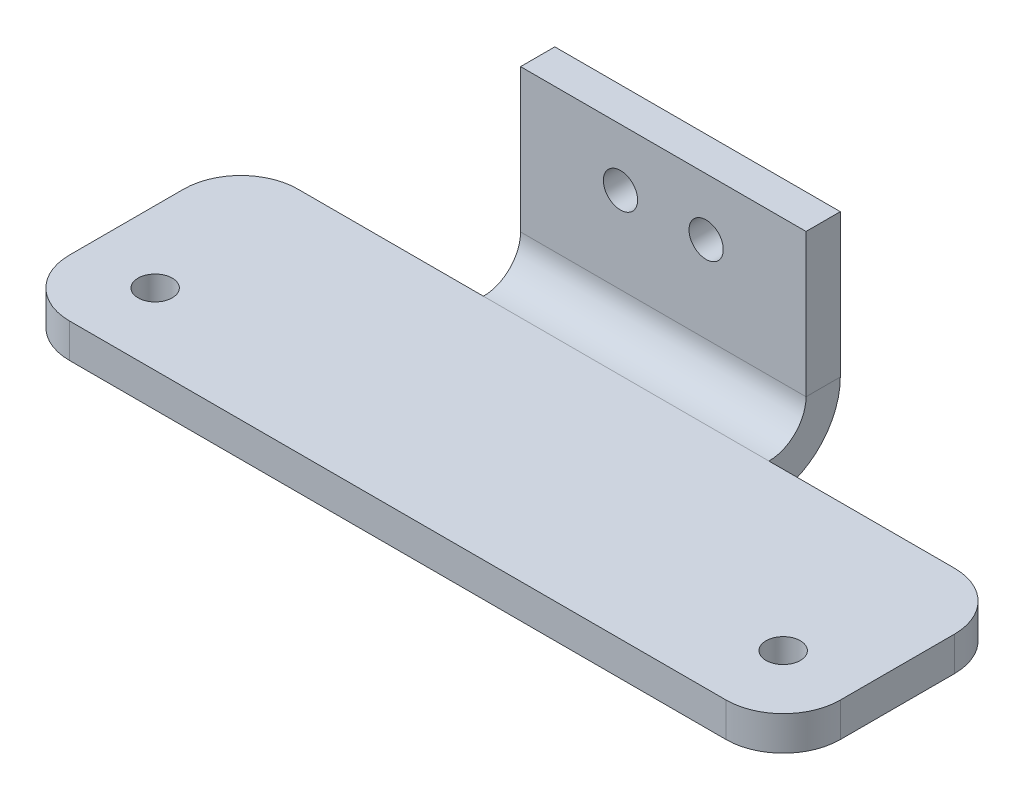
ISO-10303-21;
HEADER;
FILE_DESCRIPTION(('STEP AP214'),'2;1');
FILE_NAME('part.step','',(''),(''),'','','');
FILE_SCHEMA(('AUTOMOTIVE_DESIGN { 1 0 10303 214 1 1 1 1 }'));
ENDSEC;
DATA;
#1=APPLICATION_CONTEXT('core data for automotive mechanical design processes');
#2=APPLICATION_PROTOCOL_DEFINITION('international standard','automotive_design',2000,#1);
#3=PRODUCT_CONTEXT('',#1,'mechanical');
#4=PRODUCT('Part','Part','',(#3));
#5=PRODUCT_RELATED_PRODUCT_CATEGORY('part','',(#4));
#6=PRODUCT_DEFINITION_FORMATION('','',#4);
#7=PRODUCT_DEFINITION_CONTEXT('part definition',#1,'design');
#8=PRODUCT_DEFINITION('design','',#6,#7);
#9=PRODUCT_DEFINITION_SHAPE('','',#8);
#10=(LENGTH_UNIT() NAMED_UNIT(*) SI_UNIT(.MILLI.,.METRE.));
#11=(NAMED_UNIT(*) PLANE_ANGLE_UNIT() SI_UNIT($,.RADIAN.));
#12=(NAMED_UNIT(*) SI_UNIT($,.STERADIAN.) SOLID_ANGLE_UNIT());
#13=UNCERTAINTY_MEASURE_WITH_UNIT(LENGTH_MEASURE(1.E-05),#10,'distance_accuracy_value','');
#14=(GEOMETRIC_REPRESENTATION_CONTEXT(3) GLOBAL_UNCERTAINTY_ASSIGNED_CONTEXT((#13)) GLOBAL_UNIT_ASSIGNED_CONTEXT((#10,
#11,#12)) REPRESENTATION_CONTEXT('',''));
#15=CARTESIAN_POINT('',(0.,0.,0.));
#16=DIRECTION('',(0.,0.,1.));
#17=DIRECTION('',(1.,0.,0.));
#18=AXIS2_PLACEMENT_3D('',#15,#16,#17);
#19=CARTESIAN_POINT('',(0.,-28.4225651045515,-32.5000000000001));
#20=DIRECTION('',(0.,0.,1.));
#21=DIRECTION('',(0.,-1.,0.));
#22=AXIS2_PLACEMENT_3D('',#19,#20,#21);
#23=PLANE('',#22);
#24=CARTESIAN_POINT('',(-7.5,21.5774348954485,-32.5));
#25=DIRECTION('',(0.,0.,1.));
#26=DIRECTION('',(1.,0.,0.));
#27=AXIS2_PLACEMENT_3D('',#24,#25,#26);
#28=CIRCLE('',#27,3.);
#29=CARTESIAN_POINT('',(-4.5,21.5774348954485,-32.5));
#30=VERTEX_POINT('',#29);
#31=EDGE_CURVE('E428',#30,#30,#28,.T.);
#32=ORIENTED_EDGE('',*,*,#31,.T.);
#33=EDGE_LOOP('',(#32));
#34=FACE_BOUND('',#33,.T.);
#35=CARTESIAN_POINT('',(7.5,21.5774348954485,-32.5));
#36=DIRECTION('',(0.,0.,1.));
#37=DIRECTION('',(-1.,0.,0.));
#38=AXIS2_PLACEMENT_3D('',#35,#36,#37);
#39=CIRCLE('',#38,3.);
#40=CARTESIAN_POINT('',(4.5,21.5774348954485,-32.5));
#41=VERTEX_POINT('',#40);
#42=EDGE_CURVE('E408',#41,#41,#39,.T.);
#43=ORIENTED_EDGE('',*,*,#42,.T.);
#44=EDGE_LOOP('',(#43));
#45=FACE_BOUND('',#44,.T.);
#46=DIRECTION('',(0.,1.,0.));
#47=VECTOR('',#46,1.);
#48=CARTESIAN_POINT('',(25.,31.5774348954485,-32.4999999999999));
#49=LINE('',#48,#47);
#50=CARTESIAN_POINT('',(25.,6.50000000000005,-32.5));
#51=VERTEX_POINT('',#50);
#52=CARTESIAN_POINT('',(25.,31.5774348954485,-32.4999999999999));
#53=VERTEX_POINT('',#52);
#54=EDGE_CURVE('E185',#51,#53,#49,.T.);
#55=ORIENTED_EDGE('',*,*,#54,.F.);
#56=DIRECTION('',(-1.,0.,0.));
#57=VECTOR('',#56,1.);
#58=CARTESIAN_POINT('',(0.,6.50000000000005,-32.5));
#59=LINE('',#58,#57);
#60=CARTESIAN_POINT('',(-25.,6.50000000000005,-32.5));
#61=VERTEX_POINT('',#60);
#62=EDGE_CURVE('E159',#51,#61,#59,.T.);
#63=ORIENTED_EDGE('',*,*,#62,.T.);
#64=DIRECTION('',(0.,-1.,0.));
#65=VECTOR('',#64,1.);
#66=CARTESIAN_POINT('',(-25.,31.5774348954485,-32.4999999999999));
#67=LINE('',#66,#65);
#68=CARTESIAN_POINT('',(-25.,31.5774348954485,-32.4999999999999));
#69=VERTEX_POINT('',#68);
#70=EDGE_CURVE('E205',#69,#61,#67,.T.);
#71=ORIENTED_EDGE('',*,*,#70,.F.);
#72=DIRECTION('',(-1.,0.,0.));
#73=VECTOR('',#72,1.);
#74=CARTESIAN_POINT('',(-25.,31.5774348954485,-32.4999999999999));
#75=LINE('',#74,#73);
#76=EDGE_CURVE('E187',#53,#69,#75,.T.);
#77=ORIENTED_EDGE('',*,*,#76,.F.);
#78=EDGE_LOOP('',(#55,#63,#71,#77));
#79=FACE_BOUND('',#78,.T.);
#80=ADVANCED_FACE('F56',(#34,#45,#79),#23,.F.);
#81=CARTESIAN_POINT('',(-25.,31.5774348954485,-32.4999999999999));
#82=DIRECTION('',(-1.,0.,0.));
#83=DIRECTION('',(0.,-1.,0.));
#84=AXIS2_PLACEMENT_3D('',#81,#82,#83);
#85=PLANE('',#84);
#86=DIRECTION('',(0.,0.,-1.));
#87=VECTOR('',#86,1.);
#88=CARTESIAN_POINT('',(-25.,6.50000000000005,-32.5));
#89=LINE('',#88,#87);
#90=CARTESIAN_POINT('',(-25.,6.50000000000002,-26.5));
#91=VERTEX_POINT('',#90);
#92=EDGE_CURVE('E199',#91,#61,#89,.T.);
#93=ORIENTED_EDGE('',*,*,#92,.F.);
#94=DIRECTION('',(0.,-1.,0.));
#95=VECTOR('',#94,1.);
#96=CARTESIAN_POINT('',(-25.,31.5774348954485,-26.4999999999999));
#97=LINE('',#96,#95);
#98=CARTESIAN_POINT('',(-25.,31.5774348954485,-26.4999999999999));
#99=VERTEX_POINT('',#98);
#100=EDGE_CURVE('E191',#99,#91,#97,.T.);
#101=ORIENTED_EDGE('',*,*,#100,.F.);
#102=DIRECTION('',(0.,0.,1.));
#103=VECTOR('',#102,1.);
#104=CARTESIAN_POINT('',(-25.,31.5774348954485,-32.4999999999999));
#105=LINE('',#104,#103);
#106=EDGE_CURVE('E172',#69,#99,#105,.T.);
#107=ORIENTED_EDGE('',*,*,#106,.F.);
#108=ORIENTED_EDGE('',*,*,#70,.T.);
#109=EDGE_LOOP('',(#93,#101,#107,#108));
#110=FACE_BOUND('',#109,.T.);
#111=ADVANCED_FACE('F333',(#110),#85,.T.);
#112=CARTESIAN_POINT('',(-25.,31.5774348954485,-32.4999999999999));
#113=DIRECTION('',(0.,1.,0.));
#114=DIRECTION('',(-1.,0.,0.));
#115=AXIS2_PLACEMENT_3D('',#112,#113,#114);
#116=PLANE('',#115);
#117=DIRECTION('',(-1.,0.,0.));
#118=VECTOR('',#117,1.);
#119=CARTESIAN_POINT('',(-25.,31.5774348954485,-26.4999999999999));
#120=LINE('',#119,#118);
#121=CARTESIAN_POINT('',(25.,31.5774348954485,-26.4999999999999));
#122=VERTEX_POINT('',#121);
#123=EDGE_CURVE('E210',#122,#99,#120,.T.);
#124=ORIENTED_EDGE('',*,*,#123,.F.);
#125=DIRECTION('',(0.,0.,1.));
#126=VECTOR('',#125,1.);
#127=CARTESIAN_POINT('',(25.,31.5774348954485,-32.4999999999999));
#128=LINE('',#127,#126);
#129=EDGE_CURVE('E207',#53,#122,#128,.T.);
#130=ORIENTED_EDGE('',*,*,#129,.F.);
#131=ORIENTED_EDGE('',*,*,#76,.T.);
#132=ORIENTED_EDGE('',*,*,#106,.T.);
#133=EDGE_LOOP('',(#124,#130,#131,#132));
#134=FACE_BOUND('',#133,.T.);
#135=ADVANCED_FACE('F287',(#134),#116,.T.);
#136=CARTESIAN_POINT('',(25.,31.5774348954485,-32.4999999999999));
#137=DIRECTION('',(1.,0.,0.));
#138=DIRECTION('',(0.,1.,0.));
#139=AXIS2_PLACEMENT_3D('',#136,#137,#138);
#140=PLANE('',#139);
#141=DIRECTION('',(0.,0.,1.));
#142=VECTOR('',#141,1.);
#143=CARTESIAN_POINT('',(25.,6.50000000000005,-32.5));
#144=LINE('',#143,#142);
#145=CARTESIAN_POINT('',(25.,6.50000000000002,-26.5));
#146=VERTEX_POINT('',#145);
#147=EDGE_CURVE('E171',#51,#146,#144,.T.);
#148=ORIENTED_EDGE('',*,*,#147,.F.);
#149=ORIENTED_EDGE('',*,*,#54,.T.);
#150=ORIENTED_EDGE('',*,*,#129,.T.);
#151=DIRECTION('',(0.,1.,0.));
#152=VECTOR('',#151,1.);
#153=CARTESIAN_POINT('',(25.,31.5774348954485,-26.4999999999999));
#154=LINE('',#153,#152);
#155=EDGE_CURVE('E195',#146,#122,#154,.T.);
#156=ORIENTED_EDGE('',*,*,#155,.F.);
#157=EDGE_LOOP('',(#148,#149,#150,#156));
#158=FACE_BOUND('',#157,.T.);
#159=ADVANCED_FACE('F194',(#158),#140,.T.);
#160=CARTESIAN_POINT('',(0.,-28.4225651045515,-26.5000000000001));
#161=DIRECTION('',(0.,0.,1.));
#162=DIRECTION('',(0.,-1.,0.));
#163=AXIS2_PLACEMENT_3D('',#160,#161,#162);
#164=PLANE('',#163);
#165=CARTESIAN_POINT('',(-7.5,21.5774348954485,-26.5));
#166=DIRECTION('',(0.,0.,1.));
#167=DIRECTION('',(1.,0.,0.));
#168=AXIS2_PLACEMENT_3D('',#165,#166,#167);
#169=CIRCLE('',#168,3.);
#170=CARTESIAN_POINT('',(-4.5,21.5774348954485,-26.5));
#171=VERTEX_POINT('',#170);
#172=EDGE_CURVE('E414',#171,#171,#169,.T.);
#173=ORIENTED_EDGE('',*,*,#172,.F.);
#174=EDGE_LOOP('',(#173));
#175=FACE_BOUND('',#174,.T.);
#176=CARTESIAN_POINT('',(7.5,21.5774348954485,-26.5));
#177=DIRECTION('',(0.,0.,1.));
#178=DIRECTION('',(-1.,0.,0.));
#179=AXIS2_PLACEMENT_3D('',#176,#177,#178);
#180=CIRCLE('',#179,3.);
#181=CARTESIAN_POINT('',(4.5,21.5774348954485,-26.5));
#182=VERTEX_POINT('',#181);
#183=EDGE_CURVE('E411',#182,#182,#180,.T.);
#184=ORIENTED_EDGE('',*,*,#183,.F.);
#185=EDGE_LOOP('',(#184));
#186=FACE_BOUND('',#185,.T.);
#187=DIRECTION('',(-1.,0.,0.));
#188=VECTOR('',#187,1.);
#189=CARTESIAN_POINT('',(0.,6.50000000000003,-26.5));
#190=LINE('',#189,#188);
#191=EDGE_CURVE('E197',#146,#91,#190,.T.);
#192=ORIENTED_EDGE('',*,*,#191,.F.);
#193=ORIENTED_EDGE('',*,*,#155,.T.);
#194=ORIENTED_EDGE('',*,*,#123,.T.);
#195=ORIENTED_EDGE('',*,*,#100,.T.);
#196=EDGE_LOOP('',(#192,#193,#194,#195));
#197=FACE_BOUND('',#196,.T.);
#198=ADVANCED_FACE('F290',(#175,#186,#197),#164,.T.);
#199=CARTESIAN_POINT('',(-67.5,-6.,-20.));
#200=DIRECTION('',(-1.,0.,0.));
#201=DIRECTION('',(0.,0.,1.));
#202=AXIS2_PLACEMENT_3D('',#199,#200,#201);
#203=PLANE('',#202);
#204=DIRECTION('',(0.,0.,1.));
#205=VECTOR('',#204,1.);
#206=CARTESIAN_POINT('',(-67.5,-6.,-20.));
#207=LINE('',#206,#205);
#208=CARTESIAN_POINT('',(-67.5,-6.,-10.));
#209=VERTEX_POINT('',#208);
#210=CARTESIAN_POINT('',(-67.5,-6.,10.));
#211=VERTEX_POINT('',#210);
#212=EDGE_CURVE('E247',#209,#211,#207,.T.);
#213=ORIENTED_EDGE('',*,*,#212,.T.);
#214=DIRECTION('',(0.,1.,0.));
#215=VECTOR('',#214,1.);
#216=CARTESIAN_POINT('',(-67.5,-6.,10.));
#217=LINE('',#216,#215);
#218=CARTESIAN_POINT('',(-67.5,0.,10.));
#219=VERTEX_POINT('',#218);
#220=EDGE_CURVE('E64',#211,#219,#217,.T.);
#221=ORIENTED_EDGE('',*,*,#220,.T.);
#222=DIRECTION('',(0.,0.,1.));
#223=VECTOR('',#222,1.);
#224=CARTESIAN_POINT('',(-67.5,0.,-20.));
#225=LINE('',#224,#223);
#226=CARTESIAN_POINT('',(-67.5,0.,-10.));
#227=VERTEX_POINT('',#226);
#228=EDGE_CURVE('E245',#227,#219,#225,.T.);
#229=ORIENTED_EDGE('',*,*,#228,.F.);
#230=DIRECTION('',(0.,1.,0.));
#231=VECTOR('',#230,1.);
#232=CARTESIAN_POINT('',(-67.5,-6.,-10.));
#233=LINE('',#232,#231);
#234=EDGE_CURVE('E238',#227,#209,#233,.F.);
#235=ORIENTED_EDGE('',*,*,#234,.T.);
#236=EDGE_LOOP('',(#213,#221,#229,#235));
#237=FACE_BOUND('',#236,.T.);
#238=ADVANCED_FACE('F244',(#237),#203,.T.);
#239=CARTESIAN_POINT('',(-67.5,-6.,20.));
#240=DIRECTION('',(0.,0.,1.));
#241=DIRECTION('',(1.,0.,0.));
#242=AXIS2_PLACEMENT_3D('',#239,#240,#241);
#243=PLANE('',#242);
#244=DIRECTION('',(1.,0.,0.));
#245=VECTOR('',#244,1.);
#246=CARTESIAN_POINT('',(-67.5,-6.,20.));
#247=LINE('',#246,#245);
#248=CARTESIAN_POINT('',(-57.5,-6.,20.));
#249=VERTEX_POINT('',#248);
#250=CARTESIAN_POINT('',(57.5,-6.,20.));
#251=VERTEX_POINT('',#250);
#252=EDGE_CURVE('E274',#249,#251,#247,.T.);
#253=ORIENTED_EDGE('',*,*,#252,.T.);
#254=DIRECTION('',(0.,1.,0.));
#255=VECTOR('',#254,1.);
#256=CARTESIAN_POINT('',(57.5,-6.,20.));
#257=LINE('',#256,#255);
#258=CARTESIAN_POINT('',(57.5,0.,20.));
#259=VERTEX_POINT('',#258);
#260=EDGE_CURVE('E235',#251,#259,#257,.T.);
#261=ORIENTED_EDGE('',*,*,#260,.T.);
#262=DIRECTION('',(1.,0.,0.));
#263=VECTOR('',#262,1.);
#264=CARTESIAN_POINT('',(-67.5,0.,20.));
#265=LINE('',#264,#263);
#266=CARTESIAN_POINT('',(-57.5,0.,20.));
#267=VERTEX_POINT('',#266);
#268=EDGE_CURVE('E255',#267,#259,#265,.T.);
#269=ORIENTED_EDGE('',*,*,#268,.F.);
#270=DIRECTION('',(0.,1.,0.));
#271=VECTOR('',#270,1.);
#272=CARTESIAN_POINT('',(-57.5,-6.,20.));
#273=LINE('',#272,#271);
#274=EDGE_CURVE('E233',#267,#249,#273,.F.);
#275=ORIENTED_EDGE('',*,*,#274,.T.);
#276=EDGE_LOOP('',(#253,#261,#269,#275));
#277=FACE_BOUND('',#276,.T.);
#278=ADVANCED_FACE('F321',(#277),#243,.T.);
#279=CARTESIAN_POINT('',(67.5,-6.,-20.));
#280=DIRECTION('',(1.,0.,0.));
#281=DIRECTION('',(0.,0.,-1.));
#282=AXIS2_PLACEMENT_3D('',#279,#280,#281);
#283=PLANE('',#282);
#284=DIRECTION('',(0.,0.,-1.));
#285=VECTOR('',#284,1.);
#286=CARTESIAN_POINT('',(67.5,-6.,-20.));
#287=LINE('',#286,#285);
#288=CARTESIAN_POINT('',(67.5,-6.,10.));
#289=VERTEX_POINT('',#288);
#290=CARTESIAN_POINT('',(67.5,-6.,-10.));
#291=VERTEX_POINT('',#290);
#292=EDGE_CURVE('E271',#289,#291,#287,.T.);
#293=ORIENTED_EDGE('',*,*,#292,.T.);
#294=DIRECTION('',(0.,1.,0.));
#295=VECTOR('',#294,1.);
#296=CARTESIAN_POINT('',(67.5,-6.,-10.));
#297=LINE('',#296,#295);
#298=CARTESIAN_POINT('',(67.5,0.,-10.));
#299=VERTEX_POINT('',#298);
#300=EDGE_CURVE('E214',#291,#299,#297,.T.);
#301=ORIENTED_EDGE('',*,*,#300,.T.);
#302=DIRECTION('',(0.,0.,-1.));
#303=VECTOR('',#302,1.);
#304=CARTESIAN_POINT('',(67.5,0.,-20.));
#305=LINE('',#304,#303);
#306=CARTESIAN_POINT('',(67.5,0.,10.));
#307=VERTEX_POINT('',#306);
#308=EDGE_CURVE('E258',#307,#299,#305,.T.);
#309=ORIENTED_EDGE('',*,*,#308,.F.);
#310=DIRECTION('',(0.,1.,0.));
#311=VECTOR('',#310,1.);
#312=CARTESIAN_POINT('',(67.5,-6.,10.));
#313=LINE('',#312,#311);
#314=EDGE_CURVE('E204',#307,#289,#313,.F.);
#315=ORIENTED_EDGE('',*,*,#314,.T.);
#316=EDGE_LOOP('',(#293,#301,#309,#315));
#317=FACE_BOUND('',#316,.T.);
#318=ADVANCED_FACE('F311',(#317),#283,.T.);
#319=CARTESIAN_POINT('',(0.,-6.,0.));
#320=DIRECTION('',(0.,1.,0.));
#321=DIRECTION('',(0.,0.,1.));
#322=AXIS2_PLACEMENT_3D('',#319,#320,#321);
#323=PLANE('',#322);
#324=CARTESIAN_POINT('',(-55.,-6.,7.50000000000001));
#325=DIRECTION('',(0.,1.,0.));
#326=DIRECTION('',(0.,0.,1.));
#327=AXIS2_PLACEMENT_3D('',#324,#325,#326);
#328=CIRCLE('',#327,3.);
#329=CARTESIAN_POINT('',(-55.,-6.,10.5));
#330=VERTEX_POINT('',#329);
#331=EDGE_CURVE('E303',#330,#330,#328,.T.);
#332=ORIENTED_EDGE('',*,*,#331,.T.);
#333=EDGE_LOOP('',(#332));
#334=FACE_BOUND('',#333,.T.);
#335=CARTESIAN_POINT('',(55.,-6.,7.50000000000001));
#336=DIRECTION('',(0.,1.,0.));
#337=DIRECTION('',(0.,0.,-1.));
#338=AXIS2_PLACEMENT_3D('',#335,#336,#337);
#339=CIRCLE('',#338,3.);
#340=CARTESIAN_POINT('',(55.,-6.,4.50000000000001));
#341=VERTEX_POINT('',#340);
#342=EDGE_CURVE('E423',#341,#341,#339,.T.);
#343=ORIENTED_EDGE('',*,*,#342,.T.);
#344=EDGE_LOOP('',(#343));
#345=FACE_BOUND('',#344,.T.);
#346=DIRECTION('',(-1.,0.,0.));
#347=VECTOR('',#346,1.);
#348=CARTESIAN_POINT('',(25.,-6.,-20.));
#349=LINE('',#348,#347);
#350=CARTESIAN_POINT('',(57.5,-6.,-20.));
#351=VERTEX_POINT('',#350);
#352=CARTESIAN_POINT('',(25.,-6.,-20.));
#353=VERTEX_POINT('',#352);
#354=EDGE_CURVE('E269',#351,#353,#349,.T.);
#355=ORIENTED_EDGE('',*,*,#354,.F.);
#356=CARTESIAN_POINT('',(57.5,-6.,-10.));
#357=DIRECTION('',(0.,1.,0.));
#358=DIRECTION('',(0.,0.,1.));
#359=AXIS2_PLACEMENT_3D('',#356,#357,#358);
#360=CIRCLE('',#359,10.);
#361=EDGE_CURVE('E231',#351,#291,#360,.F.);
#362=ORIENTED_EDGE('',*,*,#361,.T.);
#363=ORIENTED_EDGE('',*,*,#292,.F.);
#364=CARTESIAN_POINT('',(57.5,-6.,10.));
#365=DIRECTION('',(0.,1.,0.));
#366=DIRECTION('',(0.,0.,1.));
#367=AXIS2_PLACEMENT_3D('',#364,#365,#366);
#368=CIRCLE('',#367,10.);
#369=EDGE_CURVE('E229',#289,#251,#368,.F.);
#370=ORIENTED_EDGE('',*,*,#369,.T.);
#371=ORIENTED_EDGE('',*,*,#252,.F.);
#372=CARTESIAN_POINT('',(-57.5,-6.,10.));
#373=DIRECTION('',(0.,1.,0.));
#374=DIRECTION('',(0.,0.,1.));
#375=AXIS2_PLACEMENT_3D('',#372,#373,#374);
#376=CIRCLE('',#375,10.);
#377=EDGE_CURVE('E77',#249,#211,#376,.F.);
#378=ORIENTED_EDGE('',*,*,#377,.T.);
#379=ORIENTED_EDGE('',*,*,#212,.F.);
#380=CARTESIAN_POINT('',(-57.5,-6.,-10.));
#381=DIRECTION('',(0.,1.,0.));
#382=DIRECTION('',(0.,0.,1.));
#383=AXIS2_PLACEMENT_3D('',#380,#381,#382);
#384=CIRCLE('',#383,10.);
#385=CARTESIAN_POINT('',(-57.5,-6.,-20.));
#386=VERTEX_POINT('',#385);
#387=EDGE_CURVE('E71',#209,#386,#384,.F.);
#388=ORIENTED_EDGE('',*,*,#387,.T.);
#389=DIRECTION('',(-1.,0.,0.));
#390=VECTOR('',#389,1.);
#391=CARTESIAN_POINT('',(-67.5,-6.,-20.));
#392=LINE('',#391,#390);
#393=CARTESIAN_POINT('',(-25.,-6.,-20.));
#394=VERTEX_POINT('',#393);
#395=EDGE_CURVE('E211',#394,#386,#392,.T.);
#396=ORIENTED_EDGE('',*,*,#395,.F.);
#397=DIRECTION('',(-1.,0.,0.));
#398=VECTOR('',#397,1.);
#399=CARTESIAN_POINT('',(0.,-6.,-20.));
#400=LINE('',#399,#398);
#401=EDGE_CURVE('E280',#353,#394,#400,.T.);
#402=ORIENTED_EDGE('',*,*,#401,.F.);
#403=EDGE_LOOP('',(#355,#362,#363,#370,#371,#378,#379,#388,#396,#402));
#404=FACE_BOUND('',#403,.T.);
#405=ADVANCED_FACE('F319',(#334,#345,#404),#323,.F.);
#406=CARTESIAN_POINT('',(25.,-6.,-20.));
#407=DIRECTION('',(0.,0.,-1.));
#408=DIRECTION('',(-1.,0.,0.));
#409=AXIS2_PLACEMENT_3D('',#406,#407,#408);
#410=PLANE('',#409);
#411=DIRECTION('',(-1.,0.,0.));
#412=VECTOR('',#411,1.);
#413=CARTESIAN_POINT('',(25.,0.,-20.));
#414=LINE('',#413,#412);
#415=CARTESIAN_POINT('',(57.5,0.,-20.));
#416=VERTEX_POINT('',#415);
#417=CARTESIAN_POINT('',(25.,0.,-20.));
#418=VERTEX_POINT('',#417);
#419=EDGE_CURVE('E266',#416,#418,#414,.T.);
#420=ORIENTED_EDGE('',*,*,#419,.F.);
#421=DIRECTION('',(0.,1.,0.));
#422=VECTOR('',#421,1.);
#423=CARTESIAN_POINT('',(57.5,-6.,-20.));
#424=LINE('',#423,#422);
#425=EDGE_CURVE('E225',#416,#351,#424,.F.);
#426=ORIENTED_EDGE('',*,*,#425,.T.);
#427=ORIENTED_EDGE('',*,*,#354,.T.);
#428=DIRECTION('',(0.,1.,0.));
#429=VECTOR('',#428,1.);
#430=CARTESIAN_POINT('',(25.,-6.,-20.));
#431=LINE('',#430,#429);
#432=EDGE_CURVE('E181',#353,#418,#431,.T.);
#433=ORIENTED_EDGE('',*,*,#432,.T.);
#434=EDGE_LOOP('',(#420,#426,#427,#433));
#435=FACE_BOUND('',#434,.T.);
#436=ADVANCED_FACE('F363',(#435),#410,.T.);
#437=CARTESIAN_POINT('',(0.,0.,0.));
#438=DIRECTION('',(0.,1.,0.));
#439=DIRECTION('',(0.,0.,1.));
#440=AXIS2_PLACEMENT_3D('',#437,#438,#439);
#441=PLANE('',#440);
#442=CARTESIAN_POINT('',(-55.,0.,7.50000000000001));
#443=DIRECTION('',(0.,1.,0.));
#444=DIRECTION('',(0.,0.,1.));
#445=AXIS2_PLACEMENT_3D('',#442,#443,#444);
#446=CIRCLE('',#445,3.);
#447=CARTESIAN_POINT('',(-55.,0.,10.5));
#448=VERTEX_POINT('',#447);
#449=EDGE_CURVE('E420',#448,#448,#446,.T.);
#450=ORIENTED_EDGE('',*,*,#449,.F.);
#451=EDGE_LOOP('',(#450));
#452=FACE_BOUND('',#451,.T.);
#453=CARTESIAN_POINT('',(55.,0.,7.50000000000001));
#454=DIRECTION('',(0.,1.,0.));
#455=DIRECTION('',(0.,0.,-1.));
#456=AXIS2_PLACEMENT_3D('',#453,#454,#455);
#457=CIRCLE('',#456,3.);
#458=CARTESIAN_POINT('',(55.,0.,4.50000000000001));
#459=VERTEX_POINT('',#458);
#460=EDGE_CURVE('E426',#459,#459,#457,.T.);
#461=ORIENTED_EDGE('',*,*,#460,.F.);
#462=EDGE_LOOP('',(#461));
#463=FACE_BOUND('',#462,.T.);
#464=ORIENTED_EDGE('',*,*,#308,.T.);
#465=CARTESIAN_POINT('',(57.5,0.,-10.));
#466=DIRECTION('',(0.,1.,0.));
#467=DIRECTION('',(0.,0.,1.));
#468=AXIS2_PLACEMENT_3D('',#465,#466,#467);
#469=CIRCLE('',#468,10.);
#470=EDGE_CURVE('E223',#299,#416,#469,.T.);
#471=ORIENTED_EDGE('',*,*,#470,.T.);
#472=ORIENTED_EDGE('',*,*,#419,.T.);
#473=DIRECTION('',(-1.,0.,0.));
#474=VECTOR('',#473,1.);
#475=CARTESIAN_POINT('',(0.,0.,-20.));
#476=LINE('',#475,#474);
#477=CARTESIAN_POINT('',(-25.,0.,-20.));
#478=VERTEX_POINT('',#477);
#479=EDGE_CURVE('E260',#418,#478,#476,.T.);
#480=ORIENTED_EDGE('',*,*,#479,.T.);
#481=DIRECTION('',(-1.,0.,0.));
#482=VECTOR('',#481,1.);
#483=CARTESIAN_POINT('',(-67.5,0.,-20.));
#484=LINE('',#483,#482);
#485=CARTESIAN_POINT('',(-57.5,0.,-20.));
#486=VERTEX_POINT('',#485);
#487=EDGE_CURVE('E256',#478,#486,#484,.T.);
#488=ORIENTED_EDGE('',*,*,#487,.T.);
#489=CARTESIAN_POINT('',(-57.5,0.,-10.));
#490=DIRECTION('',(0.,1.,0.));
#491=DIRECTION('',(0.,0.,1.));
#492=AXIS2_PLACEMENT_3D('',#489,#490,#491);
#493=CIRCLE('',#492,10.);
#494=EDGE_CURVE('E217',#486,#227,#493,.T.);
#495=ORIENTED_EDGE('',*,*,#494,.T.);
#496=ORIENTED_EDGE('',*,*,#228,.T.);
#497=CARTESIAN_POINT('',(-57.5,0.,10.));
#498=DIRECTION('',(0.,1.,0.));
#499=DIRECTION('',(0.,0.,1.));
#500=AXIS2_PLACEMENT_3D('',#497,#498,#499);
#501=CIRCLE('',#500,10.);
#502=EDGE_CURVE('E219',#219,#267,#501,.T.);
#503=ORIENTED_EDGE('',*,*,#502,.T.);
#504=ORIENTED_EDGE('',*,*,#268,.T.);
#505=CARTESIAN_POINT('',(57.5,0.,10.));
#506=DIRECTION('',(0.,1.,0.));
#507=DIRECTION('',(0.,0.,1.));
#508=AXIS2_PLACEMENT_3D('',#505,#506,#507);
#509=CIRCLE('',#508,10.);
#510=EDGE_CURVE('E221',#259,#307,#509,.T.);
#511=ORIENTED_EDGE('',*,*,#510,.T.);
#512=EDGE_LOOP('',(#464,#471,#472,#480,#488,#495,#496,#503,#504,#511));
#513=FACE_BOUND('',#512,.T.);
#514=ADVANCED_FACE('F251',(#452,#463,#513),#441,.T.);
#515=CARTESIAN_POINT('',(-67.5,-6.,-20.));
#516=DIRECTION('',(0.,0.,-1.));
#517=DIRECTION('',(-1.,0.,0.));
#518=AXIS2_PLACEMENT_3D('',#515,#516,#517);
#519=PLANE('',#518);
#520=ORIENTED_EDGE('',*,*,#395,.T.);
#521=DIRECTION('',(0.,1.,0.));
#522=VECTOR('',#521,1.);
#523=CARTESIAN_POINT('',(-57.5,-6.,-20.));
#524=LINE('',#523,#522);
#525=EDGE_CURVE('E14',#386,#486,#524,.T.);
#526=ORIENTED_EDGE('',*,*,#525,.T.);
#527=ORIENTED_EDGE('',*,*,#487,.F.);
#528=DIRECTION('',(0.,1.,0.));
#529=VECTOR('',#528,1.);
#530=CARTESIAN_POINT('',(-25.,-6.,-20.));
#531=LINE('',#530,#529);
#532=EDGE_CURVE('E278',#394,#478,#531,.T.);
#533=ORIENTED_EDGE('',*,*,#532,.F.);
#534=EDGE_LOOP('',(#520,#526,#527,#533));
#535=FACE_BOUND('',#534,.T.);
#536=ADVANCED_FACE('F365',(#535),#519,.T.);
#537=CARTESIAN_POINT('',(25.,6.5,-20.));
#538=DIRECTION('',(1.,0.,0.));
#539=DIRECTION('',(0.,0.,-1.));
#540=AXIS2_PLACEMENT_3D('',#537,#538,#539);
#541=PLANE('',#540);
#542=ORIENTED_EDGE('',*,*,#147,.T.);
#543=CARTESIAN_POINT('',(25.,6.5,-20.));
#544=DIRECTION('',(1.,0.,0.));
#545=DIRECTION('',(0.,0.,-1.));
#546=AXIS2_PLACEMENT_3D('',#543,#544,#545);
#547=CIRCLE('',#546,6.5);
#548=EDGE_CURVE('E298',#146,#418,#547,.F.);
#549=ORIENTED_EDGE('',*,*,#548,.T.);
#550=ORIENTED_EDGE('',*,*,#432,.F.);
#551=CARTESIAN_POINT('',(25.,6.5,-20.));
#552=DIRECTION('',(-1.,0.,0.));
#553=DIRECTION('',(0.,0.,-1.));
#554=AXIS2_PLACEMENT_3D('',#551,#552,#553);
#555=CIRCLE('',#554,12.5);
#556=EDGE_CURVE('E162',#51,#353,#555,.T.);
#557=ORIENTED_EDGE('',*,*,#556,.F.);
#558=EDGE_LOOP('',(#542,#549,#550,#557));
#559=FACE_BOUND('',#558,.T.);
#560=ADVANCED_FACE('F176',(#559),#541,.T.);
#561=CARTESIAN_POINT('',(-25.,6.5,-20.));
#562=DIRECTION('',(-1.,0.,0.));
#563=DIRECTION('',(0.,0.,1.));
#564=AXIS2_PLACEMENT_3D('',#561,#562,#563);
#565=PLANE('',#564);
#566=CARTESIAN_POINT('',(-25.,6.5,-20.));
#567=DIRECTION('',(1.,0.,0.));
#568=DIRECTION('',(0.,0.,-1.));
#569=AXIS2_PLACEMENT_3D('',#566,#567,#568);
#570=CIRCLE('',#569,6.5);
#571=EDGE_CURVE('E182',#478,#91,#570,.T.);
#572=ORIENTED_EDGE('',*,*,#571,.T.);
#573=ORIENTED_EDGE('',*,*,#92,.T.);
#574=CARTESIAN_POINT('',(-25.,6.5,-20.));
#575=DIRECTION('',(1.,0.,0.));
#576=DIRECTION('',(0.,0.,1.));
#577=AXIS2_PLACEMENT_3D('',#574,#575,#576);
#578=CIRCLE('',#577,12.5);
#579=EDGE_CURVE('E165',#394,#61,#578,.T.);
#580=ORIENTED_EDGE('',*,*,#579,.F.);
#581=ORIENTED_EDGE('',*,*,#532,.T.);
#582=EDGE_LOOP('',(#572,#573,#580,#581));
#583=FACE_BOUND('',#582,.T.);
#584=ADVANCED_FACE('F300',(#583),#565,.T.);
#585=CARTESIAN_POINT('',(-52.5231658347017,6.5,-20.));
#586=DIRECTION('',(1.,0.,0.));
#587=DIRECTION('',(0.,0.,-1.));
#588=AXIS2_PLACEMENT_3D('',#585,#586,#587);
#589=CYLINDRICAL_SURFACE('',#588,12.5);
#590=ORIENTED_EDGE('',*,*,#401,.T.);
#591=ORIENTED_EDGE('',*,*,#579,.T.);
#592=ORIENTED_EDGE('',*,*,#62,.F.);
#593=ORIENTED_EDGE('',*,*,#556,.T.);
#594=EDGE_LOOP('',(#590,#591,#592,#593));
#595=FACE_BOUND('',#594,.T.);
#596=ADVANCED_FACE('F161',(#595),#589,.T.);
#597=CARTESIAN_POINT('',(-52.5231658347017,6.5,-20.));
#598=DIRECTION('',(1.,0.,0.));
#599=DIRECTION('',(0.,0.,-1.));
#600=AXIS2_PLACEMENT_3D('',#597,#598,#599);
#601=CYLINDRICAL_SURFACE('',#600,6.5);
#602=ORIENTED_EDGE('',*,*,#479,.F.);
#603=ORIENTED_EDGE('',*,*,#548,.F.);
#604=ORIENTED_EDGE('',*,*,#191,.T.);
#605=ORIENTED_EDGE('',*,*,#571,.F.);
#606=EDGE_LOOP('',(#602,#603,#604,#605));
#607=FACE_BOUND('',#606,.T.);
#608=ADVANCED_FACE('F296',(#607),#601,.F.);
#609=CARTESIAN_POINT('',(55.,-6.,7.50000000000001));
#610=DIRECTION('',(0.,1.,0.));
#611=DIRECTION('',(0.,0.,1.));
#612=AXIS2_PLACEMENT_3D('',#609,#610,#611);
#613=CYLINDRICAL_SURFACE('',#612,3.);
#614=ORIENTED_EDGE('',*,*,#342,.F.);
#615=EDGE_LOOP('',(#614));
#616=FACE_BOUND('',#615,.T.);
#617=ORIENTED_EDGE('',*,*,#460,.T.);
#618=EDGE_LOOP('',(#617));
#619=FACE_BOUND('',#618,.T.);
#620=ADVANCED_FACE('F391',(#616,#619),#613,.F.);
#621=CARTESIAN_POINT('',(-55.,-6.,7.50000000000001));
#622=DIRECTION('',(0.,1.,0.));
#623=DIRECTION('',(0.,0.,1.));
#624=AXIS2_PLACEMENT_3D('',#621,#622,#623);
#625=CYLINDRICAL_SURFACE('',#624,3.);
#626=ORIENTED_EDGE('',*,*,#331,.F.);
#627=EDGE_LOOP('',(#626));
#628=FACE_BOUND('',#627,.T.);
#629=ORIENTED_EDGE('',*,*,#449,.T.);
#630=EDGE_LOOP('',(#629));
#631=FACE_BOUND('',#630,.T.);
#632=ADVANCED_FACE('F396',(#628,#631),#625,.F.);
#633=CARTESIAN_POINT('',(7.5,21.5774348954485,-32.5));
#634=DIRECTION('',(0.,0.,1.));
#635=DIRECTION('',(1.,0.,0.));
#636=AXIS2_PLACEMENT_3D('',#633,#634,#635);
#637=CYLINDRICAL_SURFACE('',#636,3.);
#638=ORIENTED_EDGE('',*,*,#42,.F.);
#639=EDGE_LOOP('',(#638));
#640=FACE_BOUND('',#639,.T.);
#641=ORIENTED_EDGE('',*,*,#183,.T.);
#642=EDGE_LOOP('',(#641));
#643=FACE_BOUND('',#642,.T.);
#644=ADVANCED_FACE('F357',(#640,#643),#637,.F.);
#645=CARTESIAN_POINT('',(-7.5,21.5774348954485,-32.5));
#646=DIRECTION('',(0.,0.,1.));
#647=DIRECTION('',(1.,0.,0.));
#648=AXIS2_PLACEMENT_3D('',#645,#646,#647);
#649=CYLINDRICAL_SURFACE('',#648,3.);
#650=ORIENTED_EDGE('',*,*,#31,.F.);
#651=EDGE_LOOP('',(#650));
#652=FACE_BOUND('',#651,.T.);
#653=ORIENTED_EDGE('',*,*,#172,.T.);
#654=EDGE_LOOP('',(#653));
#655=FACE_BOUND('',#654,.T.);
#656=ADVANCED_FACE('F352',(#652,#655),#649,.F.);
#657=CARTESIAN_POINT('',(57.5,-6.,-10.));
#658=DIRECTION('',(0.,1.,0.));
#659=DIRECTION('',(0.,0.,1.));
#660=AXIS2_PLACEMENT_3D('',#657,#658,#659);
#661=CYLINDRICAL_SURFACE('',#660,10.);
#662=ORIENTED_EDGE('',*,*,#361,.F.);
#663=ORIENTED_EDGE('',*,*,#425,.F.);
#664=ORIENTED_EDGE('',*,*,#470,.F.);
#665=ORIENTED_EDGE('',*,*,#300,.F.);
#666=EDGE_LOOP('',(#662,#663,#664,#665));
#667=FACE_BOUND('',#666,.T.);
#668=ADVANCED_FACE('F330',(#667),#661,.T.);
#669=CARTESIAN_POINT('',(57.5,-6.,10.));
#670=DIRECTION('',(0.,1.,0.));
#671=DIRECTION('',(0.,0.,1.));
#672=AXIS2_PLACEMENT_3D('',#669,#670,#671);
#673=CYLINDRICAL_SURFACE('',#672,10.);
#674=ORIENTED_EDGE('',*,*,#369,.F.);
#675=ORIENTED_EDGE('',*,*,#314,.F.);
#676=ORIENTED_EDGE('',*,*,#510,.F.);
#677=ORIENTED_EDGE('',*,*,#260,.F.);
#678=EDGE_LOOP('',(#674,#675,#676,#677));
#679=FACE_BOUND('',#678,.T.);
#680=ADVANCED_FACE('F316',(#679),#673,.T.);
#681=CARTESIAN_POINT('',(-57.5,-6.,10.));
#682=DIRECTION('',(0.,1.,0.));
#683=DIRECTION('',(0.,0.,1.));
#684=AXIS2_PLACEMENT_3D('',#681,#682,#683);
#685=CYLINDRICAL_SURFACE('',#684,10.);
#686=ORIENTED_EDGE('',*,*,#377,.F.);
#687=ORIENTED_EDGE('',*,*,#274,.F.);
#688=ORIENTED_EDGE('',*,*,#502,.F.);
#689=ORIENTED_EDGE('',*,*,#220,.F.);
#690=EDGE_LOOP('',(#686,#687,#688,#689));
#691=FACE_BOUND('',#690,.T.);
#692=ADVANCED_FACE('F323',(#691),#685,.T.);
#693=CARTESIAN_POINT('',(-57.5,-6.,-10.));
#694=DIRECTION('',(0.,1.,0.));
#695=DIRECTION('',(0.,0.,1.));
#696=AXIS2_PLACEMENT_3D('',#693,#694,#695);
#697=CYLINDRICAL_SURFACE('',#696,10.);
#698=ORIENTED_EDGE('',*,*,#387,.F.);
#699=ORIENTED_EDGE('',*,*,#234,.F.);
#700=ORIENTED_EDGE('',*,*,#494,.F.);
#701=ORIENTED_EDGE('',*,*,#525,.F.);
#702=EDGE_LOOP('',(#698,#699,#700,#701));
#703=FACE_BOUND('',#702,.T.);
#704=ADVANCED_FACE('F58',(#703),#697,.T.);
#705=CLOSED_SHELL('',(#80,#111,#135,#159,#198,#238,#278,#318,#405,#436,#514,#536,#560,#584,#596,
#608,#620,#632,#644,#656,#668,#680,#692,#704));
#706=MANIFOLD_SOLID_BREP('B2',#705);
#707=ADVANCED_BREP_SHAPE_REPRESENTATION('',(#18,#706),#14);
#708=SHAPE_DEFINITION_REPRESENTATION(#9,#707);
ENDSEC;
END-ISO-10303-21;
